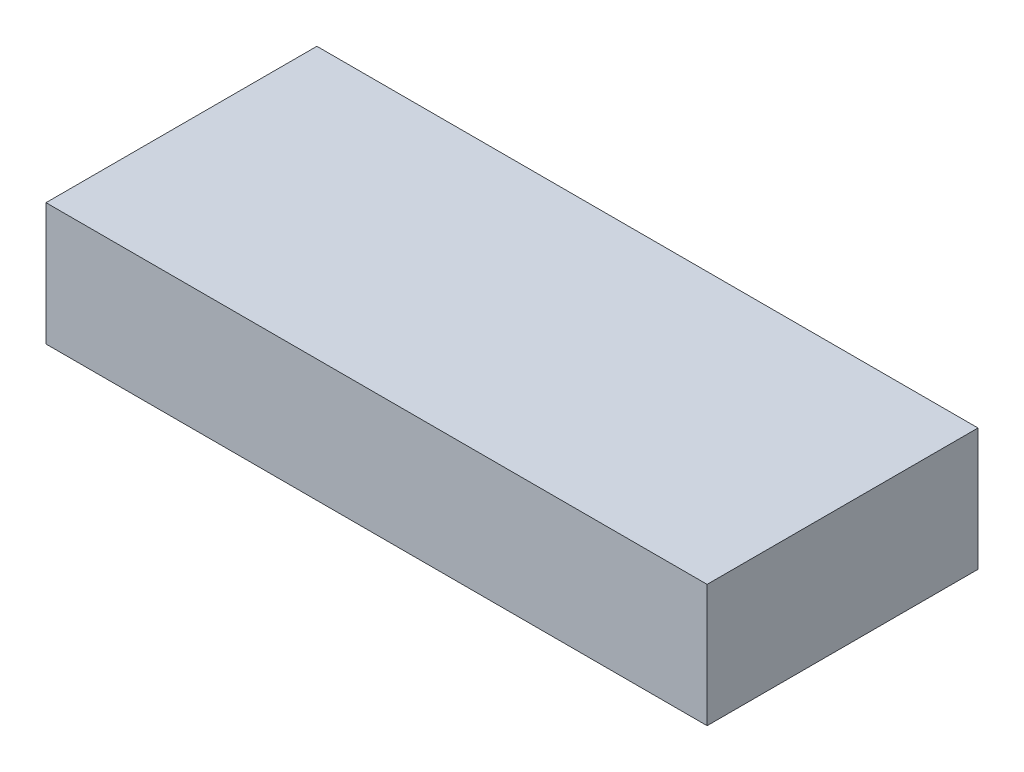
ISO-10303-21;
HEADER;
FILE_DESCRIPTION(('STEP AP214'),'2;1');
FILE_NAME('part.step','',(''),(''),'','','');
FILE_SCHEMA(('AUTOMOTIVE_DESIGN { 1 0 10303 214 1 1 1 1 }'));
ENDSEC;
DATA;
#1=APPLICATION_CONTEXT('core data for automotive mechanical design processes');
#2=APPLICATION_PROTOCOL_DEFINITION('international standard','automotive_design',2000,#1);
#3=PRODUCT_CONTEXT('',#1,'mechanical');
#4=PRODUCT('Part','Part','',(#3));
#5=PRODUCT_RELATED_PRODUCT_CATEGORY('part','',(#4));
#6=PRODUCT_DEFINITION_FORMATION('','',#4);
#7=PRODUCT_DEFINITION_CONTEXT('part definition',#1,'design');
#8=PRODUCT_DEFINITION('design','',#6,#7);
#9=PRODUCT_DEFINITION_SHAPE('','',#8);
#10=(LENGTH_UNIT() NAMED_UNIT(*) SI_UNIT(.MILLI.,.METRE.));
#11=(NAMED_UNIT(*) PLANE_ANGLE_UNIT() SI_UNIT($,.RADIAN.));
#12=(NAMED_UNIT(*) SI_UNIT($,.STERADIAN.) SOLID_ANGLE_UNIT());
#13=UNCERTAINTY_MEASURE_WITH_UNIT(LENGTH_MEASURE(1.E-05),#10,'distance_accuracy_value','');
#14=(GEOMETRIC_REPRESENTATION_CONTEXT(3) GLOBAL_UNCERTAINTY_ASSIGNED_CONTEXT((#13)) GLOBAL_UNIT_ASSIGNED_CONTEXT((#10,
#11,#12)) REPRESENTATION_CONTEXT('',''));
#15=CARTESIAN_POINT('',(0.,0.,0.));
#16=DIRECTION('',(0.,0.,1.));
#17=DIRECTION('',(1.,0.,0.));
#18=AXIS2_PLACEMENT_3D('',#15,#16,#17);
#19=CARTESIAN_POINT('',(29.,87.,-129.));
#20=DIRECTION('',(0.,1.,0.));
#21=DIRECTION('',(0.,0.,-1.));
#22=AXIS2_PLACEMENT_3D('',#19,#20,#21);
#23=PLANE('',#22);
#24=DIRECTION('',(1.,0.,0.));
#25=VECTOR('',#24,1.);
#26=CARTESIAN_POINT('',(7.4,87.,-120.15));
#27=LINE('',#26,#25);
#28=CARTESIAN_POINT('',(7.4,87.,-120.15));
#29=VERTEX_POINT('',#28);
#30=CARTESIAN_POINT('',(50.6,87.,-120.15));
#31=VERTEX_POINT('',#30);
#32=EDGE_CURVE('E82',#29,#31,#27,.T.);
#33=ORIENTED_EDGE('',*,*,#32,.T.);
#34=DIRECTION('',(0.,0.,-1.));
#35=VECTOR('',#34,1.);
#36=CARTESIAN_POINT('',(50.6,87.,-120.15));
#37=LINE('',#36,#35);
#38=CARTESIAN_POINT('',(50.6,87.,-137.85));
#39=VERTEX_POINT('',#38);
#40=EDGE_CURVE('E85',#31,#39,#37,.T.);
#41=ORIENTED_EDGE('',*,*,#40,.T.);
#42=DIRECTION('',(-1.,0.,0.));
#43=VECTOR('',#42,1.);
#44=CARTESIAN_POINT('',(50.6,87.,-137.85));
#45=LINE('',#44,#43);
#46=CARTESIAN_POINT('',(7.4,87.,-137.85));
#47=VERTEX_POINT('',#46);
#48=EDGE_CURVE('E75',#39,#47,#45,.T.);
#49=ORIENTED_EDGE('',*,*,#48,.T.);
#50=DIRECTION('',(0.,0.,1.));
#51=VECTOR('',#50,1.);
#52=CARTESIAN_POINT('',(7.4,87.,-137.85));
#53=LINE('',#52,#51);
#54=EDGE_CURVE('E11',#47,#29,#53,.T.);
#55=ORIENTED_EDGE('',*,*,#54,.T.);
#56=EDGE_LOOP('',(#33,#41,#49,#55));
#57=FACE_BOUND('',#56,.T.);
#58=ADVANCED_FACE('F17',(#57),#23,.T.);
#59=CARTESIAN_POINT('',(29.,79.,-129.));
#60=DIRECTION('',(0.,1.,0.));
#61=DIRECTION('',(0.,0.,-1.));
#62=AXIS2_PLACEMENT_3D('',#59,#60,#61);
#63=PLANE('',#62);
#64=DIRECTION('',(0.,0.,1.));
#65=VECTOR('',#64,1.);
#66=CARTESIAN_POINT('',(7.4,79.,-137.85));
#67=LINE('',#66,#65);
#68=CARTESIAN_POINT('',(7.4,79.,-137.85));
#69=VERTEX_POINT('',#68);
#70=CARTESIAN_POINT('',(7.4,79.,-120.15));
#71=VERTEX_POINT('',#70);
#72=EDGE_CURVE('E20',#69,#71,#67,.T.);
#73=ORIENTED_EDGE('',*,*,#72,.F.);
#74=DIRECTION('',(-1.,0.,0.));
#75=VECTOR('',#74,1.);
#76=CARTESIAN_POINT('',(50.6,79.,-137.85));
#77=LINE('',#76,#75);
#78=CARTESIAN_POINT('',(50.6,79.,-137.85));
#79=VERTEX_POINT('',#78);
#80=EDGE_CURVE('E64',#79,#69,#77,.T.);
#81=ORIENTED_EDGE('',*,*,#80,.F.);
#82=DIRECTION('',(0.,0.,-1.));
#83=VECTOR('',#82,1.);
#84=CARTESIAN_POINT('',(50.6,79.,-120.15));
#85=LINE('',#84,#83);
#86=CARTESIAN_POINT('',(50.6,79.,-120.15));
#87=VERTEX_POINT('',#86);
#88=EDGE_CURVE('E93',#87,#79,#85,.T.);
#89=ORIENTED_EDGE('',*,*,#88,.F.);
#90=DIRECTION('',(1.,0.,0.));
#91=VECTOR('',#90,1.);
#92=CARTESIAN_POINT('',(7.4,79.,-120.15));
#93=LINE('',#92,#91);
#94=EDGE_CURVE('E163',#71,#87,#93,.T.);
#95=ORIENTED_EDGE('',*,*,#94,.F.);
#96=EDGE_LOOP('',(#73,#81,#89,#95));
#97=FACE_BOUND('',#96,.T.);
#98=ADVANCED_FACE('F140',(#97),#63,.F.);
#99=CARTESIAN_POINT('',(7.4,79.,-137.85));
#100=DIRECTION('',(1.,0.,0.));
#101=DIRECTION('',(0.,1.,0.));
#102=AXIS2_PLACEMENT_3D('',#99,#100,#101);
#103=PLANE('',#102);
#104=ORIENTED_EDGE('',*,*,#72,.T.);
#105=DIRECTION('',(0.,1.,0.));
#106=VECTOR('',#105,1.);
#107=CARTESIAN_POINT('',(7.4,79.,-120.15));
#108=LINE('',#107,#106);
#109=EDGE_CURVE('E100',#71,#29,#108,.T.);
#110=ORIENTED_EDGE('',*,*,#109,.T.);
#111=ORIENTED_EDGE('',*,*,#54,.F.);
#112=DIRECTION('',(0.,1.,0.));
#113=VECTOR('',#112,1.);
#114=CARTESIAN_POINT('',(7.4,79.,-137.85));
#115=LINE('',#114,#113);
#116=EDGE_CURVE('E80',#69,#47,#115,.T.);
#117=ORIENTED_EDGE('',*,*,#116,.F.);
#118=EDGE_LOOP('',(#104,#110,#111,#117));
#119=FACE_BOUND('',#118,.T.);
#120=ADVANCED_FACE('F127',(#119),#103,.F.);
#121=CARTESIAN_POINT('',(50.6,79.,-137.85));
#122=DIRECTION('',(0.,0.,1.));
#123=DIRECTION('',(0.,-1.,0.));
#124=AXIS2_PLACEMENT_3D('',#121,#122,#123);
#125=PLANE('',#124);
#126=ORIENTED_EDGE('',*,*,#80,.T.);
#127=ORIENTED_EDGE('',*,*,#116,.T.);
#128=ORIENTED_EDGE('',*,*,#48,.F.);
#129=DIRECTION('',(0.,1.,0.));
#130=VECTOR('',#129,1.);
#131=CARTESIAN_POINT('',(50.6,79.,-137.85));
#132=LINE('',#131,#130);
#133=EDGE_CURVE('E74',#79,#39,#132,.T.);
#134=ORIENTED_EDGE('',*,*,#133,.F.);
#135=EDGE_LOOP('',(#126,#127,#128,#134));
#136=FACE_BOUND('',#135,.T.);
#137=ADVANCED_FACE('F73',(#136),#125,.F.);
#138=CARTESIAN_POINT('',(50.6,79.,-120.15));
#139=DIRECTION('',(-1.,0.,0.));
#140=DIRECTION('',(0.,0.,1.));
#141=AXIS2_PLACEMENT_3D('',#138,#139,#140);
#142=PLANE('',#141);
#143=ORIENTED_EDGE('',*,*,#88,.T.);
#144=ORIENTED_EDGE('',*,*,#133,.T.);
#145=ORIENTED_EDGE('',*,*,#40,.F.);
#146=DIRECTION('',(0.,1.,0.));
#147=VECTOR('',#146,1.);
#148=CARTESIAN_POINT('',(50.6,79.,-120.15));
#149=LINE('',#148,#147);
#150=EDGE_CURVE('E168',#87,#31,#149,.T.);
#151=ORIENTED_EDGE('',*,*,#150,.F.);
#152=EDGE_LOOP('',(#143,#144,#145,#151));
#153=FACE_BOUND('',#152,.T.);
#154=ADVANCED_FACE('F89',(#153),#142,.F.);
#155=CARTESIAN_POINT('',(7.4,79.,-120.15));
#156=DIRECTION('',(0.,0.,-1.));
#157=DIRECTION('',(-1.,0.,0.));
#158=AXIS2_PLACEMENT_3D('',#155,#156,#157);
#159=PLANE('',#158);
#160=ORIENTED_EDGE('',*,*,#94,.T.);
#161=ORIENTED_EDGE('',*,*,#150,.T.);
#162=ORIENTED_EDGE('',*,*,#32,.F.);
#163=ORIENTED_EDGE('',*,*,#109,.F.);
#164=EDGE_LOOP('',(#160,#161,#162,#163));
#165=FACE_BOUND('',#164,.T.);
#166=ADVANCED_FACE('F107',(#165),#159,.F.);
#167=CLOSED_SHELL('',(#58,#98,#120,#137,#154,#166));
#168=MANIFOLD_SOLID_BREP('B1',#167);
#169=ADVANCED_BREP_SHAPE_REPRESENTATION('',(#18,#168),#14);
#170=SHAPE_DEFINITION_REPRESENTATION(#9,#169);
ENDSEC;
END-ISO-10303-21;
